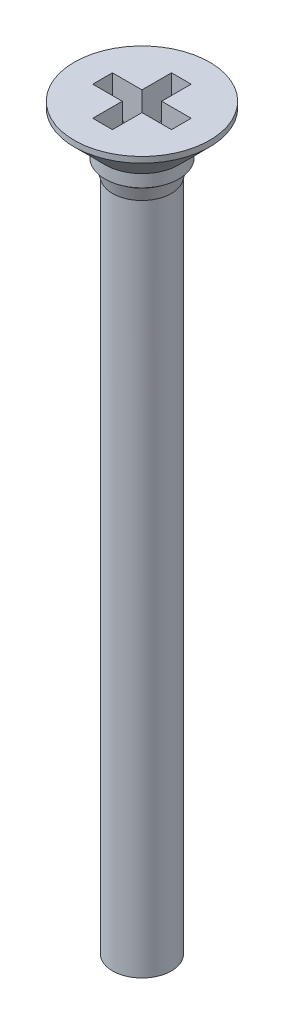
ISO-10303-21;
HEADER;
FILE_DESCRIPTION(('STEP AP214'),'2;1');
FILE_NAME('part.step','',(''),(''),'','','');
FILE_SCHEMA(('AUTOMOTIVE_DESIGN { 1 0 10303 214 1 1 1 1 }'));
ENDSEC;
DATA;
#1=APPLICATION_CONTEXT('core data for automotive mechanical design processes');
#2=APPLICATION_PROTOCOL_DEFINITION('international standard','automotive_design',2000,#1);
#3=PRODUCT_CONTEXT('',#1,'mechanical');
#4=PRODUCT('Part','Part','',(#3));
#5=PRODUCT_RELATED_PRODUCT_CATEGORY('part','',(#4));
#6=PRODUCT_DEFINITION_FORMATION('','',#4);
#7=PRODUCT_DEFINITION_CONTEXT('part definition',#1,'design');
#8=PRODUCT_DEFINITION('design','',#6,#7);
#9=PRODUCT_DEFINITION_SHAPE('','',#8);
#10=(LENGTH_UNIT() NAMED_UNIT(*) SI_UNIT(.MILLI.,.METRE.));
#11=(NAMED_UNIT(*) PLANE_ANGLE_UNIT() SI_UNIT($,.RADIAN.));
#12=(NAMED_UNIT(*) SI_UNIT($,.STERADIAN.) SOLID_ANGLE_UNIT());
#13=UNCERTAINTY_MEASURE_WITH_UNIT(LENGTH_MEASURE(1.E-05),#10,'distance_accuracy_value','');
#14=(GEOMETRIC_REPRESENTATION_CONTEXT(3) GLOBAL_UNCERTAINTY_ASSIGNED_CONTEXT((#13)) GLOBAL_UNIT_ASSIGNED_CONTEXT((#10,
#11,#12)) REPRESENTATION_CONTEXT('',''));
#15=CARTESIAN_POINT('',(0.,0.,0.));
#16=DIRECTION('',(0.,0.,1.));
#17=DIRECTION('',(1.,0.,0.));
#18=AXIS2_PLACEMENT_3D('',#15,#16,#17);
#19=CARTESIAN_POINT('',(0.,-2.65,-0.4));
#20=DIRECTION('',(0.,0.,-1.));
#21=DIRECTION('',(-1.,0.,0.));
#22=AXIS2_PLACEMENT_3D('',#19,#20,#21);
#23=PLANE('',#22);
#24=DIRECTION('',(0.,1.,0.));
#25=VECTOR('',#24,1.);
#26=CARTESIAN_POINT('',(0.4,-2.65,-0.4));
#27=LINE('',#26,#25);
#28=CARTESIAN_POINT('',(0.4,-2.1,-0.4));
#29=VERTEX_POINT('',#28);
#30=CARTESIAN_POINT('',(0.4,0.,-0.4));
#31=VERTEX_POINT('',#30);
#32=EDGE_CURVE('E215',#29,#31,#27,.T.);
#33=ORIENTED_EDGE('',*,*,#32,.F.);
#34=DIRECTION('',(1.,0.,0.));
#35=VECTOR('',#34,1.);
#36=CARTESIAN_POINT('',(-0.550000000000002,-2.1,-0.4));
#37=LINE('',#36,#35);
#38=CARTESIAN_POINT('',(0.550000000000002,-2.1,-0.4));
#39=VERTEX_POINT('',#38);
#40=EDGE_CURVE('E250',#29,#39,#37,.T.);
#41=ORIENTED_EDGE('',*,*,#40,.T.);
#42=DIRECTION('',(0.707106781186546,0.707106781186548,0.));
#43=VECTOR('',#42,1.);
#44=CARTESIAN_POINT('',(1.6,-1.05,-0.4));
#45=LINE('',#44,#43);
#46=CARTESIAN_POINT('',(1.6,-1.05,-0.4));
#47=VERTEX_POINT('',#46);
#48=EDGE_CURVE('E254',#39,#47,#45,.T.);
#49=ORIENTED_EDGE('',*,*,#48,.T.);
#50=DIRECTION('',(0.,1.,0.));
#51=VECTOR('',#50,1.);
#52=CARTESIAN_POINT('',(1.6,0.,-0.4));
#53=LINE('',#52,#51);
#54=CARTESIAN_POINT('',(1.6,0.,-0.4));
#55=VERTEX_POINT('',#54);
#56=EDGE_CURVE('E257',#47,#55,#53,.T.);
#57=ORIENTED_EDGE('',*,*,#56,.T.);
#58=DIRECTION('',(-1.,0.,0.));
#59=VECTOR('',#58,1.);
#60=CARTESIAN_POINT('',(1.6,0.,-0.4));
#61=LINE('',#60,#59);
#62=EDGE_CURVE('E261',#55,#31,#61,.T.);
#63=ORIENTED_EDGE('',*,*,#62,.T.);
#64=EDGE_LOOP('',(#33,#41,#49,#57,#63));
#65=FACE_BOUND('',#64,.T.);
#66=ADVANCED_FACE('F50',(#65),#23,.F.);
#67=CARTESIAN_POINT('',(0.,-2.65,0.4));
#68=DIRECTION('',(0.,0.,-1.));
#69=DIRECTION('',(-1.,0.,0.));
#70=AXIS2_PLACEMENT_3D('',#67,#68,#69);
#71=PLANE('',#70);
#72=DIRECTION('',(1.,0.,0.));
#73=VECTOR('',#72,1.);
#74=CARTESIAN_POINT('',(-0.550000000000002,-2.1,0.4));
#75=LINE('',#74,#73);
#76=CARTESIAN_POINT('',(0.4,-2.1,0.4));
#77=VERTEX_POINT('',#76);
#78=CARTESIAN_POINT('',(0.550000000000002,-2.1,0.4));
#79=VERTEX_POINT('',#78);
#80=EDGE_CURVE('E232',#77,#79,#75,.T.);
#81=ORIENTED_EDGE('',*,*,#80,.F.);
#82=DIRECTION('',(0.,1.,0.));
#83=VECTOR('',#82,1.);
#84=CARTESIAN_POINT('',(0.4,-2.65,0.4));
#85=LINE('',#84,#83);
#86=CARTESIAN_POINT('',(0.4,0.,0.4));
#87=VERTEX_POINT('',#86);
#88=EDGE_CURVE('E58',#77,#87,#85,.T.);
#89=ORIENTED_EDGE('',*,*,#88,.T.);
#90=DIRECTION('',(-1.,0.,0.));
#91=VECTOR('',#90,1.);
#92=CARTESIAN_POINT('',(1.6,0.,0.4));
#93=LINE('',#92,#91);
#94=CARTESIAN_POINT('',(1.6,0.,0.4));
#95=VERTEX_POINT('',#94);
#96=EDGE_CURVE('E241',#95,#87,#93,.T.);
#97=ORIENTED_EDGE('',*,*,#96,.F.);
#98=DIRECTION('',(0.,1.,0.));
#99=VECTOR('',#98,1.);
#100=CARTESIAN_POINT('',(1.6,0.,0.4));
#101=LINE('',#100,#99);
#102=CARTESIAN_POINT('',(1.6,-1.05,0.4));
#103=VERTEX_POINT('',#102);
#104=EDGE_CURVE('E238',#103,#95,#101,.T.);
#105=ORIENTED_EDGE('',*,*,#104,.F.);
#106=DIRECTION('',(0.707106781186546,0.707106781186548,0.));
#107=VECTOR('',#106,1.);
#108=CARTESIAN_POINT('',(1.6,-1.05,0.4));
#109=LINE('',#108,#107);
#110=EDGE_CURVE('E235',#79,#103,#109,.T.);
#111=ORIENTED_EDGE('',*,*,#110,.F.);
#112=EDGE_LOOP('',(#81,#89,#97,#105,#111));
#113=FACE_BOUND('',#112,.T.);
#114=ADVANCED_FACE('F304',(#113),#71,.T.);
#115=CARTESIAN_POINT('',(0.,0.,0.));
#116=DIRECTION('',(0.,-1.,0.));
#117=DIRECTION('',(1.,0.,0.));
#118=AXIS2_PLACEMENT_3D('',#115,#116,#117);
#119=PLANE('',#118);
#120=DIRECTION('',(1.,0.,0.));
#121=VECTOR('',#120,1.);
#122=CARTESIAN_POINT('',(-0.4,0.,1.6));
#123=LINE('',#122,#121);
#124=CARTESIAN_POINT('',(-0.4,0.,1.6));
#125=VERTEX_POINT('',#124);
#126=CARTESIAN_POINT('',(0.4,0.,1.6));
#127=VERTEX_POINT('',#126);
#128=EDGE_CURVE('E216',#125,#127,#123,.T.);
#129=ORIENTED_EDGE('',*,*,#128,.F.);
#130=DIRECTION('',(0.,0.,1.));
#131=VECTOR('',#130,1.);
#132=CARTESIAN_POINT('',(-0.4,0.,-1.6));
#133=LINE('',#132,#131);
#134=CARTESIAN_POINT('',(-0.4,0.,0.399999999999999));
#135=VERTEX_POINT('',#134);
#136=EDGE_CURVE('E209',#135,#125,#133,.T.);
#137=ORIENTED_EDGE('',*,*,#136,.F.);
#138=CARTESIAN_POINT('',(-1.6,0.,0.4));
#139=VERTEX_POINT('',#138);
#140=EDGE_CURVE('E240',#135,#139,#93,.T.);
#141=ORIENTED_EDGE('',*,*,#140,.T.);
#142=DIRECTION('',(0.,0.,1.));
#143=VECTOR('',#142,1.);
#144=CARTESIAN_POINT('',(-1.6,0.,-0.4));
#145=LINE('',#144,#143);
#146=CARTESIAN_POINT('',(-1.6,0.,-0.4));
#147=VERTEX_POINT('',#146);
#148=EDGE_CURVE('E271',#147,#139,#145,.T.);
#149=ORIENTED_EDGE('',*,*,#148,.F.);
#150=CARTESIAN_POINT('',(-0.4,0.,-0.4));
#151=VERTEX_POINT('',#150);
#152=EDGE_CURVE('E260',#151,#147,#61,.T.);
#153=ORIENTED_EDGE('',*,*,#152,.F.);
#154=CARTESIAN_POINT('',(-0.4,0.,-1.6));
#155=VERTEX_POINT('',#154);
#156=EDGE_CURVE('E210',#155,#151,#133,.T.);
#157=ORIENTED_EDGE('',*,*,#156,.F.);
#158=DIRECTION('',(1.,0.,0.));
#159=VECTOR('',#158,1.);
#160=CARTESIAN_POINT('',(-0.4,0.,-1.6));
#161=LINE('',#160,#159);
#162=CARTESIAN_POINT('',(0.4,0.,-1.6));
#163=VERTEX_POINT('',#162);
#164=EDGE_CURVE('E218',#155,#163,#161,.T.);
#165=ORIENTED_EDGE('',*,*,#164,.T.);
#166=DIRECTION('',(0.,0.,1.));
#167=VECTOR('',#166,1.);
#168=CARTESIAN_POINT('',(0.4,0.,-1.6));
#169=LINE('',#168,#167);
#170=EDGE_CURVE('E194',#163,#31,#169,.T.);
#171=ORIENTED_EDGE('',*,*,#170,.T.);
#172=ORIENTED_EDGE('',*,*,#62,.F.);
#173=DIRECTION('',(0.,0.,1.));
#174=VECTOR('',#173,1.);
#175=CARTESIAN_POINT('',(1.6,0.,-0.4));
#176=LINE('',#175,#174);
#177=EDGE_CURVE('E274',#55,#95,#176,.T.);
#178=ORIENTED_EDGE('',*,*,#177,.T.);
#179=ORIENTED_EDGE('',*,*,#96,.T.);
#180=EDGE_CURVE('E73',#87,#127,#169,.T.);
#181=ORIENTED_EDGE('',*,*,#180,.T.);
#182=EDGE_LOOP('',(#129,#137,#141,#149,#153,#157,#165,#171,#172,#178,#179,#181));
#183=FACE_BOUND('',#182,.T.);
#184=CARTESIAN_POINT('',(0.,0.,0.));
#185=DIRECTION('',(0.,1.,0.));
#186=DIRECTION('',(-1.,0.,0.));
#187=AXIS2_PLACEMENT_3D('',#184,#185,#186);
#188=CIRCLE('',#187,2.75);
#189=CARTESIAN_POINT('',(-2.75,0.,0.));
#190=VERTEX_POINT('',#189);
#191=EDGE_CURVE('E300',#190,#190,#188,.T.);
#192=ORIENTED_EDGE('',*,*,#191,.T.);
#193=EDGE_LOOP('',(#192));
#194=FACE_BOUND('',#193,.T.);
#195=ADVANCED_FACE('F52',(#183,#194),#119,.F.);
#196=CARTESIAN_POINT('',(0.,0.,0.));
#197=DIRECTION('',(0.,1.,0.));
#198=DIRECTION('',(-1.,0.,0.));
#199=AXIS2_PLACEMENT_3D('',#196,#197,#198);
#200=CYLINDRICAL_SURFACE('',#199,2.75);
#201=ORIENTED_EDGE('',*,*,#191,.F.);
#202=EDGE_LOOP('',(#201));
#203=FACE_BOUND('',#202,.T.);
#204=CARTESIAN_POINT('',(0.,-0.237500000000007,0.));
#205=DIRECTION('',(0.,1.,0.));
#206=DIRECTION('',(-1.,0.,0.));
#207=AXIS2_PLACEMENT_3D('',#204,#205,#206);
#208=CIRCLE('',#207,2.75);
#209=CARTESIAN_POINT('',(-2.75,-0.237500000000007,0.));
#210=VERTEX_POINT('',#209);
#211=EDGE_CURVE('E297',#210,#210,#208,.T.);
#212=ORIENTED_EDGE('',*,*,#211,.T.);
#213=EDGE_LOOP('',(#212));
#214=FACE_BOUND('',#213,.T.);
#215=ADVANCED_FACE('F409',(#203,#214),#200,.T.);
#216=CARTESIAN_POINT('',(0.,-1.4875,0.));
#217=DIRECTION('',(0.,1.,0.));
#218=DIRECTION('',(-1.,0.,0.));
#219=AXIS2_PLACEMENT_3D('',#216,#217,#218);
#220=CONICAL_SURFACE('',#219,1.5,0.78539816339745);
#221=ORIENTED_EDGE('',*,*,#211,.F.);
#222=EDGE_LOOP('',(#221));
#223=FACE_BOUND('',#222,.T.);
#224=CARTESIAN_POINT('',(0.,-1.4875,0.));
#225=DIRECTION('',(0.,1.,0.));
#226=DIRECTION('',(-1.,0.,0.));
#227=AXIS2_PLACEMENT_3D('',#224,#225,#226);
#228=CIRCLE('',#227,1.5);
#229=CARTESIAN_POINT('',(-1.5,-1.4875,0.));
#230=VERTEX_POINT('',#229);
#231=EDGE_CURVE('E294',#230,#230,#228,.T.);
#232=ORIENTED_EDGE('',*,*,#231,.T.);
#233=EDGE_LOOP('',(#232));
#234=FACE_BOUND('',#233,.T.);
#235=ADVANCED_FACE('F406',(#223,#234),#220,.T.);
#236=CARTESIAN_POINT('',(0.,0.,0.));
#237=DIRECTION('',(0.,1.,0.));
#238=DIRECTION('',(-1.,0.,0.));
#239=AXIS2_PLACEMENT_3D('',#236,#237,#238);
#240=CYLINDRICAL_SURFACE('',#239,1.5);
#241=ORIENTED_EDGE('',*,*,#231,.F.);
#242=EDGE_LOOP('',(#241));
#243=FACE_BOUND('',#242,.T.);
#244=CARTESIAN_POINT('',(0.,-1.9875,0.));
#245=DIRECTION('',(0.,1.,0.));
#246=DIRECTION('',(-1.,0.,0.));
#247=AXIS2_PLACEMENT_3D('',#244,#245,#246);
#248=CIRCLE('',#247,1.5);
#249=CARTESIAN_POINT('',(-1.5,-1.9875,0.));
#250=VERTEX_POINT('',#249);
#251=EDGE_CURVE('E291',#250,#250,#248,.T.);
#252=ORIENTED_EDGE('',*,*,#251,.T.);
#253=EDGE_LOOP('',(#252));
#254=FACE_BOUND('',#253,.T.);
#255=ADVANCED_FACE('F402',(#243,#254),#240,.T.);
#256=CARTESIAN_POINT('',(1.5,-1.9875,0.));
#257=DIRECTION('',(0.,1.,0.));
#258=DIRECTION('',(-1.,0.,0.));
#259=AXIS2_PLACEMENT_3D('',#256,#257,#258);
#260=PLANE('',#259);
#261=ORIENTED_EDGE('',*,*,#251,.F.);
#262=EDGE_LOOP('',(#261));
#263=FACE_BOUND('',#262,.T.);
#264=CARTESIAN_POINT('',(0.,-1.9875,0.));
#265=DIRECTION('',(0.,1.,0.));
#266=DIRECTION('',(-1.,0.,0.));
#267=AXIS2_PLACEMENT_3D('',#264,#265,#266);
#268=CIRCLE('',#267,1.3375);
#269=CARTESIAN_POINT('',(-1.3375,-1.9875,0.));
#270=VERTEX_POINT('',#269);
#271=EDGE_CURVE('E288',#270,#270,#268,.T.);
#272=ORIENTED_EDGE('',*,*,#271,.T.);
#273=EDGE_LOOP('',(#272));
#274=FACE_BOUND('',#273,.T.);
#275=ADVANCED_FACE('F398',(#263,#274),#260,.F.);
#276=CARTESIAN_POINT('',(0.,0.,0.));
#277=DIRECTION('',(0.,1.,0.));
#278=DIRECTION('',(-1.,0.,0.));
#279=AXIS2_PLACEMENT_3D('',#276,#277,#278);
#280=CYLINDRICAL_SURFACE('',#279,1.3375);
#281=ORIENTED_EDGE('',*,*,#271,.F.);
#282=EDGE_LOOP('',(#281));
#283=FACE_BOUND('',#282,.T.);
#284=CARTESIAN_POINT('',(0.,-2.11258468371008,0.));
#285=DIRECTION('',(0.,1.,0.));
#286=DIRECTION('',(-1.,0.,0.));
#287=AXIS2_PLACEMENT_3D('',#284,#285,#286);
#288=CIRCLE('',#287,1.3375);
#289=CARTESIAN_POINT('',(-1.3375,-2.11258468371008,0.));
#290=VERTEX_POINT('',#289);
#291=EDGE_CURVE('E285',#290,#290,#288,.T.);
#292=ORIENTED_EDGE('',*,*,#291,.T.);
#293=EDGE_LOOP('',(#292));
#294=FACE_BOUND('',#293,.T.);
#295=ADVANCED_FACE('F394',(#283,#294),#280,.T.);
#296=CARTESIAN_POINT('',(0.,-2.65,0.));
#297=DIRECTION('',(0.,1.,0.));
#298=DIRECTION('',(-1.,0.,0.));
#299=AXIS2_PLACEMENT_3D('',#296,#297,#298);
#300=CONICAL_SURFACE('',#299,1.1935,0.26179938779915);
#301=ORIENTED_EDGE('',*,*,#291,.F.);
#302=EDGE_LOOP('',(#301));
#303=FACE_BOUND('',#302,.T.);
#304=CARTESIAN_POINT('',(0.,-2.65,0.));
#305=DIRECTION('',(0.,1.,0.));
#306=DIRECTION('',(-1.,0.,0.));
#307=AXIS2_PLACEMENT_3D('',#304,#305,#306);
#308=CIRCLE('',#307,1.1935);
#309=CARTESIAN_POINT('',(-1.1935,-2.65,0.));
#310=VERTEX_POINT('',#309);
#311=EDGE_CURVE('E270',#310,#310,#308,.T.);
#312=ORIENTED_EDGE('',*,*,#311,.T.);
#313=EDGE_LOOP('',(#312));
#314=FACE_BOUND('',#313,.T.);
#315=ADVANCED_FACE('F390',(#303,#314),#300,.T.);
#316=CARTESIAN_POINT('',(0.,0.,0.));
#317=DIRECTION('',(0.,1.,0.));
#318=DIRECTION('',(-1.,0.,0.));
#319=AXIS2_PLACEMENT_3D('',#316,#317,#318);
#320=CYLINDRICAL_SURFACE('',#319,1.1935);
#321=ORIENTED_EDGE('',*,*,#311,.F.);
#322=EDGE_LOOP('',(#321));
#323=FACE_BOUND('',#322,.T.);
#324=CARTESIAN_POINT('',(0.,-30.,0.));
#325=DIRECTION('',(0.,-1.,0.));
#326=DIRECTION('',(1.,0.,0.));
#327=AXIS2_PLACEMENT_3D('',#324,#325,#326);
#328=CIRCLE('',#327,1.1935);
#329=CARTESIAN_POINT('',(1.1935,-30.,0.));
#330=VERTEX_POINT('',#329);
#331=EDGE_CURVE('E185',#330,#330,#328,.T.);
#332=ORIENTED_EDGE('',*,*,#331,.F.);
#333=EDGE_LOOP('',(#332));
#334=FACE_BOUND('',#333,.T.);
#335=ADVANCED_FACE('F387',(#323,#334),#320,.T.);
#336=CARTESIAN_POINT('',(-1.6,-1.05,-0.4));
#337=DIRECTION('',(-0.707106781186548,-0.707106781186546,0.));
#338=DIRECTION('',(0.707106781186547,-0.707106781186548,0.));
#339=AXIS2_PLACEMENT_3D('',#336,#337,#338);
#340=PLANE('',#339);
#341=DIRECTION('',(0.,0.,1.));
#342=VECTOR('',#341,1.);
#343=CARTESIAN_POINT('',(-0.550000000000002,-2.1,-0.4));
#344=LINE('',#343,#342);
#345=CARTESIAN_POINT('',(-0.550000000000002,-2.1,-0.4));
#346=VERTEX_POINT('',#345);
#347=CARTESIAN_POINT('',(-0.550000000000002,-2.1,0.4));
#348=VERTEX_POINT('',#347);
#349=EDGE_CURVE('E267',#346,#348,#344,.T.);
#350=ORIENTED_EDGE('',*,*,#349,.F.);
#351=DIRECTION('',(0.707106781186546,-0.707106781186548,0.));
#352=VECTOR('',#351,1.);
#353=CARTESIAN_POINT('',(-1.6,-1.05,-0.4));
#354=LINE('',#353,#352);
#355=CARTESIAN_POINT('',(-1.6,-1.05,-0.4));
#356=VERTEX_POINT('',#355);
#357=EDGE_CURVE('E247',#356,#346,#354,.T.);
#358=ORIENTED_EDGE('',*,*,#357,.F.);
#359=DIRECTION('',(0.,0.,1.));
#360=VECTOR('',#359,1.);
#361=CARTESIAN_POINT('',(-1.6,-1.05,-0.4));
#362=LINE('',#361,#360);
#363=CARTESIAN_POINT('',(-1.6,-1.05,0.4));
#364=VERTEX_POINT('',#363);
#365=EDGE_CURVE('E268',#356,#364,#362,.T.);
#366=ORIENTED_EDGE('',*,*,#365,.T.);
#367=DIRECTION('',(0.707106781186546,-0.707106781186548,0.));
#368=VECTOR('',#367,1.);
#369=CARTESIAN_POINT('',(-1.6,-1.05,0.4));
#370=LINE('',#369,#368);
#371=EDGE_CURVE('E229',#364,#348,#370,.T.);
#372=ORIENTED_EDGE('',*,*,#371,.T.);
#373=EDGE_LOOP('',(#350,#358,#366,#372));
#374=FACE_BOUND('',#373,.T.);
#375=ADVANCED_FACE('F341',(#374),#340,.F.);
#376=CARTESIAN_POINT('',(-1.6,0.,-0.4));
#377=DIRECTION('',(-1.,0.,0.));
#378=DIRECTION('',(0.,0.,1.));
#379=AXIS2_PLACEMENT_3D('',#376,#377,#378);
#380=PLANE('',#379);
#381=ORIENTED_EDGE('',*,*,#365,.F.);
#382=DIRECTION('',(0.,-1.,0.));
#383=VECTOR('',#382,1.);
#384=CARTESIAN_POINT('',(-1.6,0.,-0.4));
#385=LINE('',#384,#383);
#386=EDGE_CURVE('E264',#147,#356,#385,.T.);
#387=ORIENTED_EDGE('',*,*,#386,.F.);
#388=ORIENTED_EDGE('',*,*,#148,.T.);
#389=DIRECTION('',(0.,-1.,0.));
#390=VECTOR('',#389,1.);
#391=CARTESIAN_POINT('',(-1.6,0.,0.4));
#392=LINE('',#391,#390);
#393=EDGE_CURVE('E244',#139,#364,#392,.T.);
#394=ORIENTED_EDGE('',*,*,#393,.T.);
#395=EDGE_LOOP('',(#381,#387,#388,#394));
#396=FACE_BOUND('',#395,.T.);
#397=ADVANCED_FACE('F386',(#396),#380,.F.);
#398=CARTESIAN_POINT('',(1.6,0.,-0.4));
#399=DIRECTION('',(1.,0.,0.));
#400=DIRECTION('',(0.,0.,-1.));
#401=AXIS2_PLACEMENT_3D('',#398,#399,#400);
#402=PLANE('',#401);
#403=ORIENTED_EDGE('',*,*,#177,.F.);
#404=ORIENTED_EDGE('',*,*,#56,.F.);
#405=DIRECTION('',(0.,0.,1.));
#406=VECTOR('',#405,1.);
#407=CARTESIAN_POINT('',(1.6,-1.05,-0.4));
#408=LINE('',#407,#406);
#409=EDGE_CURVE('E277',#47,#103,#408,.T.);
#410=ORIENTED_EDGE('',*,*,#409,.T.);
#411=ORIENTED_EDGE('',*,*,#104,.T.);
#412=EDGE_LOOP('',(#403,#404,#410,#411));
#413=FACE_BOUND('',#412,.T.);
#414=ADVANCED_FACE('F313',(#413),#402,.F.);
#415=CARTESIAN_POINT('',(1.6,-1.05,-0.4));
#416=DIRECTION('',(0.707106781186548,-0.707106781186546,0.));
#417=DIRECTION('',(0.707106781186547,0.707106781186548,0.));
#418=AXIS2_PLACEMENT_3D('',#415,#416,#417);
#419=PLANE('',#418);
#420=ORIENTED_EDGE('',*,*,#409,.F.);
#421=ORIENTED_EDGE('',*,*,#48,.F.);
#422=DIRECTION('',(0.,0.,1.));
#423=VECTOR('',#422,1.);
#424=CARTESIAN_POINT('',(0.550000000000002,-2.1,-0.4));
#425=LINE('',#424,#423);
#426=EDGE_CURVE('E279',#39,#79,#425,.T.);
#427=ORIENTED_EDGE('',*,*,#426,.T.);
#428=ORIENTED_EDGE('',*,*,#110,.T.);
#429=EDGE_LOOP('',(#420,#421,#427,#428));
#430=FACE_BOUND('',#429,.T.);
#431=ADVANCED_FACE('F319',(#430),#419,.F.);
#432=CARTESIAN_POINT('',(-0.550000000000002,-2.1,-0.4));
#433=DIRECTION('',(0.,-1.,0.));
#434=DIRECTION('',(0.,0.,-1.));
#435=AXIS2_PLACEMENT_3D('',#432,#433,#434);
#436=PLANE('',#435);
#437=CARTESIAN_POINT('',(-0.4,-2.1,0.4));
#438=VERTEX_POINT('',#437);
#439=EDGE_CURVE('E233',#348,#438,#75,.T.);
#440=ORIENTED_EDGE('',*,*,#439,.T.);
#441=DIRECTION('',(0.,0.,-1.));
#442=VECTOR('',#441,1.);
#443=CARTESIAN_POINT('',(-0.4,-2.1,0.550000000000002));
#444=LINE('',#443,#442);
#445=CARTESIAN_POINT('',(-0.4,-2.1,0.550000000000002));
#446=VERTEX_POINT('',#445);
#447=EDGE_CURVE('E169',#446,#438,#444,.T.);
#448=ORIENTED_EDGE('',*,*,#447,.F.);
#449=DIRECTION('',(1.,0.,0.));
#450=VECTOR('',#449,1.);
#451=CARTESIAN_POINT('',(-0.4,-2.1,0.550000000000002));
#452=LINE('',#451,#450);
#453=CARTESIAN_POINT('',(0.4,-2.1,0.550000000000002));
#454=VERTEX_POINT('',#453);
#455=EDGE_CURVE('E163',#446,#454,#452,.T.);
#456=ORIENTED_EDGE('',*,*,#455,.T.);
#457=DIRECTION('',(0.,0.,-1.));
#458=VECTOR('',#457,1.);
#459=CARTESIAN_POINT('',(0.4,-2.1,0.550000000000002));
#460=LINE('',#459,#458);
#461=EDGE_CURVE('E167',#454,#77,#460,.T.);
#462=ORIENTED_EDGE('',*,*,#461,.T.);
#463=ORIENTED_EDGE('',*,*,#80,.T.);
#464=ORIENTED_EDGE('',*,*,#426,.F.);
#465=ORIENTED_EDGE('',*,*,#40,.F.);
#466=CARTESIAN_POINT('',(0.4,-2.1,-0.550000000000002));
#467=VERTEX_POINT('',#466);
#468=EDGE_CURVE('E65',#29,#467,#460,.T.);
#469=ORIENTED_EDGE('',*,*,#468,.T.);
#470=DIRECTION('',(1.,0.,0.));
#471=VECTOR('',#470,1.);
#472=CARTESIAN_POINT('',(-0.4,-2.1,-0.550000000000002));
#473=LINE('',#472,#471);
#474=CARTESIAN_POINT('',(-0.4,-2.1,-0.550000000000002));
#475=VERTEX_POINT('',#474);
#476=EDGE_CURVE('E174',#475,#467,#473,.T.);
#477=ORIENTED_EDGE('',*,*,#476,.F.);
#478=CARTESIAN_POINT('',(-0.4,-2.1,-0.4));
#479=VERTEX_POINT('',#478);
#480=EDGE_CURVE('E201',#479,#475,#444,.T.);
#481=ORIENTED_EDGE('',*,*,#480,.F.);
#482=EDGE_CURVE('E251',#346,#479,#37,.T.);
#483=ORIENTED_EDGE('',*,*,#482,.F.);
#484=ORIENTED_EDGE('',*,*,#349,.T.);
#485=EDGE_LOOP('',(#440,#448,#456,#462,#463,#464,#465,#469,#477,#481,#483,#484));
#486=FACE_BOUND('',#485,.T.);
#487=ADVANCED_FACE('F166',(#486),#436,.F.);
#488=ORIENTED_EDGE('',*,*,#482,.T.);
#489=DIRECTION('',(0.,1.,0.));
#490=VECTOR('',#489,1.);
#491=CARTESIAN_POINT('',(-0.4,-2.65,-0.4));
#492=LINE('',#491,#490);
#493=EDGE_CURVE('E226',#479,#151,#492,.T.);
#494=ORIENTED_EDGE('',*,*,#493,.T.);
#495=ORIENTED_EDGE('',*,*,#152,.T.);
#496=ORIENTED_EDGE('',*,*,#386,.T.);
#497=ORIENTED_EDGE('',*,*,#357,.T.);
#498=EDGE_LOOP('',(#488,#494,#495,#496,#497));
#499=FACE_BOUND('',#498,.T.);
#500=ADVANCED_FACE('F336',(#499),#23,.F.);
#501=DIRECTION('',(0.,1.,0.));
#502=VECTOR('',#501,1.);
#503=CARTESIAN_POINT('',(-0.4,-2.65,0.4));
#504=LINE('',#503,#502);
#505=EDGE_CURVE('E13',#438,#135,#504,.T.);
#506=ORIENTED_EDGE('',*,*,#505,.F.);
#507=ORIENTED_EDGE('',*,*,#439,.F.);
#508=ORIENTED_EDGE('',*,*,#371,.F.);
#509=ORIENTED_EDGE('',*,*,#393,.F.);
#510=ORIENTED_EDGE('',*,*,#140,.F.);
#511=EDGE_LOOP('',(#506,#507,#508,#509,#510));
#512=FACE_BOUND('',#511,.T.);
#513=ADVANCED_FACE('F346',(#512),#71,.T.);
#514=CARTESIAN_POINT('',(-0.4,-1.05,1.6));
#515=DIRECTION('',(0.,-0.707106781186546,0.707106781186548));
#516=DIRECTION('',(0.,-0.707106781186548,-0.707106781186547));
#517=AXIS2_PLACEMENT_3D('',#514,#515,#516);
#518=PLANE('',#517);
#519=ORIENTED_EDGE('',*,*,#455,.F.);
#520=DIRECTION('',(0.,-0.707106781186548,-0.707106781186546));
#521=VECTOR('',#520,1.);
#522=CARTESIAN_POINT('',(-0.4,-1.05,1.6));
#523=LINE('',#522,#521);
#524=CARTESIAN_POINT('',(-0.4,-1.05,1.6));
#525=VERTEX_POINT('',#524);
#526=EDGE_CURVE('E199',#525,#446,#523,.T.);
#527=ORIENTED_EDGE('',*,*,#526,.F.);
#528=DIRECTION('',(1.,0.,0.));
#529=VECTOR('',#528,1.);
#530=CARTESIAN_POINT('',(-0.4,-1.05,1.6));
#531=LINE('',#530,#529);
#532=CARTESIAN_POINT('',(0.4,-1.05,1.6));
#533=VERTEX_POINT('',#532);
#534=EDGE_CURVE('E183',#525,#533,#531,.T.);
#535=ORIENTED_EDGE('',*,*,#534,.T.);
#536=DIRECTION('',(0.,-0.707106781186548,-0.707106781186546));
#537=VECTOR('',#536,1.);
#538=CARTESIAN_POINT('',(0.4,-1.05,1.6));
#539=LINE('',#538,#537);
#540=EDGE_CURVE('E179',#533,#454,#539,.T.);
#541=ORIENTED_EDGE('',*,*,#540,.T.);
#542=EDGE_LOOP('',(#519,#527,#535,#541));
#543=FACE_BOUND('',#542,.T.);
#544=ADVANCED_FACE('F182',(#543),#518,.F.);
#545=CARTESIAN_POINT('',(-0.4,-2.65,0.));
#546=DIRECTION('',(-1.,0.,0.));
#547=DIRECTION('',(0.,0.,1.));
#548=AXIS2_PLACEMENT_3D('',#545,#546,#547);
#549=PLANE('',#548);
#550=ORIENTED_EDGE('',*,*,#505,.T.);
#551=ORIENTED_EDGE('',*,*,#136,.T.);
#552=DIRECTION('',(0.,-1.,0.));
#553=VECTOR('',#552,1.);
#554=CARTESIAN_POINT('',(-0.4,0.,1.6));
#555=LINE('',#554,#553);
#556=EDGE_CURVE('E175',#125,#525,#555,.T.);
#557=ORIENTED_EDGE('',*,*,#556,.T.);
#558=ORIENTED_EDGE('',*,*,#526,.T.);
#559=ORIENTED_EDGE('',*,*,#447,.T.);
#560=EDGE_LOOP('',(#550,#551,#557,#558,#559));
#561=FACE_BOUND('',#560,.T.);
#562=ADVANCED_FACE('F351',(#561),#549,.F.);
#563=CARTESIAN_POINT('',(0.4,-2.65,0.));
#564=DIRECTION('',(-1.,0.,0.));
#565=DIRECTION('',(0.,0.,1.));
#566=AXIS2_PLACEMENT_3D('',#563,#564,#565);
#567=PLANE('',#566);
#568=ORIENTED_EDGE('',*,*,#461,.F.);
#569=ORIENTED_EDGE('',*,*,#540,.F.);
#570=DIRECTION('',(0.,-1.,0.));
#571=VECTOR('',#570,1.);
#572=CARTESIAN_POINT('',(0.4,0.,1.6));
#573=LINE('',#572,#571);
#574=EDGE_CURVE('E197',#127,#533,#573,.T.);
#575=ORIENTED_EDGE('',*,*,#574,.F.);
#576=ORIENTED_EDGE('',*,*,#180,.F.);
#577=ORIENTED_EDGE('',*,*,#88,.F.);
#578=EDGE_LOOP('',(#568,#569,#575,#576,#577));
#579=FACE_BOUND('',#578,.T.);
#580=ADVANCED_FACE('F178',(#579),#567,.T.);
#581=CARTESIAN_POINT('',(-0.4,0.,1.6));
#582=DIRECTION('',(0.,0.,1.));
#583=DIRECTION('',(1.,0.,0.));
#584=AXIS2_PLACEMENT_3D('',#581,#582,#583);
#585=PLANE('',#584);
#586=ORIENTED_EDGE('',*,*,#534,.F.);
#587=ORIENTED_EDGE('',*,*,#556,.F.);
#588=ORIENTED_EDGE('',*,*,#128,.T.);
#589=ORIENTED_EDGE('',*,*,#574,.T.);
#590=EDGE_LOOP('',(#586,#587,#588,#589));
#591=FACE_BOUND('',#590,.T.);
#592=ADVANCED_FACE('F355',(#591),#585,.F.);
#593=ORIENTED_EDGE('',*,*,#480,.T.);
#594=DIRECTION('',(0.,0.707106781186548,-0.707106781186546));
#595=VECTOR('',#594,1.);
#596=CARTESIAN_POINT('',(-0.4,-1.05,-1.6));
#597=LINE('',#596,#595);
#598=CARTESIAN_POINT('',(-0.4,-1.05,-1.6));
#599=VERTEX_POINT('',#598);
#600=EDGE_CURVE('E203',#475,#599,#597,.T.);
#601=ORIENTED_EDGE('',*,*,#600,.T.);
#602=DIRECTION('',(0.,1.,0.));
#603=VECTOR('',#602,1.);
#604=CARTESIAN_POINT('',(-0.4,0.,-1.6));
#605=LINE('',#604,#603);
#606=EDGE_CURVE('E206',#599,#155,#605,.T.);
#607=ORIENTED_EDGE('',*,*,#606,.T.);
#608=ORIENTED_EDGE('',*,*,#156,.T.);
#609=ORIENTED_EDGE('',*,*,#493,.F.);
#610=EDGE_LOOP('',(#593,#601,#607,#608,#609));
#611=FACE_BOUND('',#610,.T.);
#612=ADVANCED_FACE('F333',(#611),#549,.F.);
#613=ORIENTED_EDGE('',*,*,#32,.T.);
#614=ORIENTED_EDGE('',*,*,#170,.F.);
#615=DIRECTION('',(0.,1.,0.));
#616=VECTOR('',#615,1.);
#617=CARTESIAN_POINT('',(0.4,0.,-1.6));
#618=LINE('',#617,#616);
#619=CARTESIAN_POINT('',(0.4,-1.05,-1.6));
#620=VERTEX_POINT('',#619);
#621=EDGE_CURVE('E192',#620,#163,#618,.T.);
#622=ORIENTED_EDGE('',*,*,#621,.F.);
#623=DIRECTION('',(0.,0.707106781186548,-0.707106781186546));
#624=VECTOR('',#623,1.);
#625=CARTESIAN_POINT('',(0.4,-1.05,-1.6));
#626=LINE('',#625,#624);
#627=EDGE_CURVE('E180',#467,#620,#626,.T.);
#628=ORIENTED_EDGE('',*,*,#627,.F.);
#629=ORIENTED_EDGE('',*,*,#468,.F.);
#630=EDGE_LOOP('',(#613,#614,#622,#628,#629));
#631=FACE_BOUND('',#630,.T.);
#632=ADVANCED_FACE('F326',(#631),#567,.T.);
#633=CARTESIAN_POINT('',(-0.4,0.,-1.6));
#634=DIRECTION('',(0.,0.,-1.));
#635=DIRECTION('',(-1.,0.,0.));
#636=AXIS2_PLACEMENT_3D('',#633,#634,#635);
#637=PLANE('',#636);
#638=ORIENTED_EDGE('',*,*,#164,.F.);
#639=ORIENTED_EDGE('',*,*,#606,.F.);
#640=DIRECTION('',(1.,0.,0.));
#641=VECTOR('',#640,1.);
#642=CARTESIAN_POINT('',(-0.4,-1.05,-1.6));
#643=LINE('',#642,#641);
#644=EDGE_CURVE('E221',#599,#620,#643,.T.);
#645=ORIENTED_EDGE('',*,*,#644,.T.);
#646=ORIENTED_EDGE('',*,*,#621,.T.);
#647=EDGE_LOOP('',(#638,#639,#645,#646));
#648=FACE_BOUND('',#647,.T.);
#649=ADVANCED_FACE('F329',(#648),#637,.F.);
#650=CARTESIAN_POINT('',(-0.4,-1.05,-1.6));
#651=DIRECTION('',(0.,-0.707106781186546,-0.707106781186548));
#652=DIRECTION('',(0.,0.707106781186548,-0.707106781186547));
#653=AXIS2_PLACEMENT_3D('',#650,#651,#652);
#654=PLANE('',#653);
#655=ORIENTED_EDGE('',*,*,#644,.F.);
#656=ORIENTED_EDGE('',*,*,#600,.F.);
#657=ORIENTED_EDGE('',*,*,#476,.T.);
#658=ORIENTED_EDGE('',*,*,#627,.T.);
#659=EDGE_LOOP('',(#655,#656,#657,#658));
#660=FACE_BOUND('',#659,.T.);
#661=ADVANCED_FACE('F324',(#660),#654,.F.);
#662=CARTESIAN_POINT('',(0.,-30.,0.));
#663=DIRECTION('',(0.,-1.,0.));
#664=DIRECTION('',(1.,0.,0.));
#665=AXIS2_PLACEMENT_3D('',#662,#663,#664);
#666=PLANE('',#665);
#667=ORIENTED_EDGE('',*,*,#331,.T.);
#668=EDGE_LOOP('',(#667));
#669=FACE_BOUND('',#668,.T.);
#670=ADVANCED_FACE('F432',(#669),#666,.T.);
#671=CLOSED_SHELL('',(#66,#114,#195,#215,#235,#255,#275,#295,#315,#335,#375,#397,#414,#431,#487,
#500,#513,#544,#562,#580,#592,#612,#632,#649,#661,#670));
#672=MANIFOLD_SOLID_BREP('B2',#671);
#673=ADVANCED_BREP_SHAPE_REPRESENTATION('',(#18,#672),#14);
#674=SHAPE_DEFINITION_REPRESENTATION(#9,#673);
ENDSEC;
END-ISO-10303-21;
